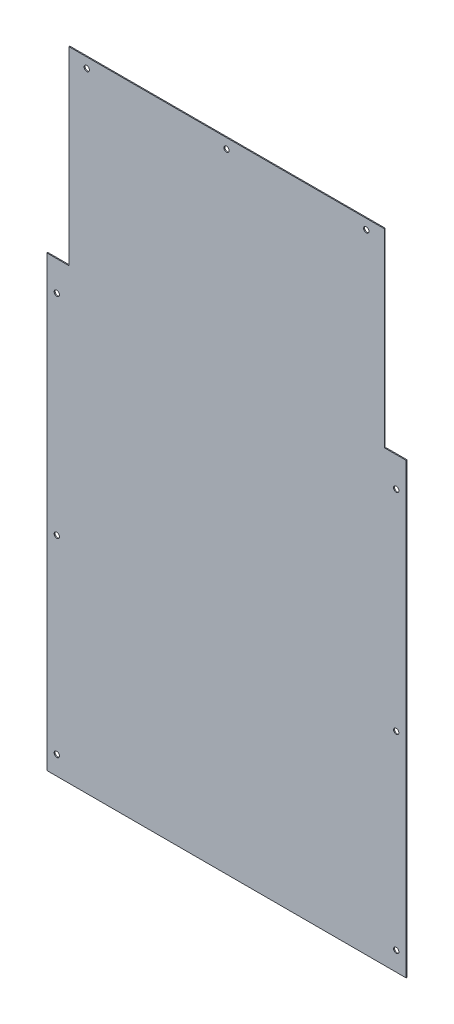
ISO-10303-21;
HEADER;
FILE_DESCRIPTION(('STEP AP214'),'2;1');
FILE_NAME('part.step','',(''),(''),'','','');
FILE_SCHEMA(('AUTOMOTIVE_DESIGN { 1 0 10303 214 1 1 1 1 }'));
ENDSEC;
DATA;
#1=APPLICATION_CONTEXT('core data for automotive mechanical design processes');
#2=APPLICATION_PROTOCOL_DEFINITION('international standard','automotive_design',2000,#1);
#3=PRODUCT_CONTEXT('',#1,'mechanical');
#4=PRODUCT('Part','Part','',(#3));
#5=PRODUCT_RELATED_PRODUCT_CATEGORY('part','',(#4));
#6=PRODUCT_DEFINITION_FORMATION('','',#4);
#7=PRODUCT_DEFINITION_CONTEXT('part definition',#1,'design');
#8=PRODUCT_DEFINITION('design','',#6,#7);
#9=PRODUCT_DEFINITION_SHAPE('','',#8);
#10=(LENGTH_UNIT() NAMED_UNIT(*) SI_UNIT(.MILLI.,.METRE.));
#11=(NAMED_UNIT(*) PLANE_ANGLE_UNIT() SI_UNIT($,.RADIAN.));
#12=(NAMED_UNIT(*) SI_UNIT($,.STERADIAN.) SOLID_ANGLE_UNIT());
#13=UNCERTAINTY_MEASURE_WITH_UNIT(LENGTH_MEASURE(1.E-05),#10,'distance_accuracy_value','');
#14=(GEOMETRIC_REPRESENTATION_CONTEXT(3) GLOBAL_UNCERTAINTY_ASSIGNED_CONTEXT((#13)) GLOBAL_UNIT_ASSIGNED_CONTEXT((#10,
#11,#12)) REPRESENTATION_CONTEXT('',''));
#15=CARTESIAN_POINT('',(0.,0.,0.));
#16=DIRECTION('',(0.,0.,1.));
#17=DIRECTION('',(1.,0.,0.));
#18=AXIS2_PLACEMENT_3D('',#15,#16,#17);
#19=CARTESIAN_POINT('',(457.2,0.,1.2192));
#20=DIRECTION('',(-1.,0.,0.));
#21=DIRECTION('',(0.,0.,1.));
#22=AXIS2_PLACEMENT_3D('',#19,#20,#21);
#23=PLANE('',#22);
#24=DIRECTION('',(0.,0.,1.));
#25=VECTOR('',#24,1.);
#26=CARTESIAN_POINT('',(457.2,570.23,0.));
#27=LINE('',#26,#25);
#28=CARTESIAN_POINT('',(457.2,570.23,0.));
#29=VERTEX_POINT('',#28);
#30=CARTESIAN_POINT('',(457.2,570.23,1.2192));
#31=VERTEX_POINT('',#30);
#32=EDGE_CURVE('E130',#29,#31,#27,.T.);
#33=ORIENTED_EDGE('',*,*,#32,.T.);
#34=DIRECTION('',(0.,1.,0.));
#35=VECTOR('',#34,1.);
#36=CARTESIAN_POINT('',(457.2,0.,1.2192));
#37=LINE('',#36,#35);
#38=CARTESIAN_POINT('',(457.2,0.,1.2192));
#39=VERTEX_POINT('',#38);
#40=EDGE_CURVE('E115',#39,#31,#37,.T.);
#41=ORIENTED_EDGE('',*,*,#40,.F.);
#42=DIRECTION('',(0.,0.,-1.));
#43=VECTOR('',#42,1.);
#44=CARTESIAN_POINT('',(457.2,0.,1.2192));
#45=LINE('',#44,#43);
#46=CARTESIAN_POINT('',(457.2,0.,0.));
#47=VERTEX_POINT('',#46);
#48=EDGE_CURVE('E72',#39,#47,#45,.T.);
#49=ORIENTED_EDGE('',*,*,#48,.T.);
#50=DIRECTION('',(0.,1.,0.));
#51=VECTOR('',#50,1.);
#52=CARTESIAN_POINT('',(457.2,0.,0.));
#53=LINE('',#52,#51);
#54=EDGE_CURVE('E108',#47,#29,#53,.T.);
#55=ORIENTED_EDGE('',*,*,#54,.T.);
#56=EDGE_LOOP('',(#33,#41,#49,#55));
#57=FACE_BOUND('',#56,.T.);
#58=ADVANCED_FACE('F64',(#57),#23,.F.);
#59=CARTESIAN_POINT('',(0.,0.,1.2192));
#60=DIRECTION('',(1.,0.,0.));
#61=DIRECTION('',(0.,0.,-1.));
#62=AXIS2_PLACEMENT_3D('',#59,#60,#61);
#63=PLANE('',#62);
#64=DIRECTION('',(0.,-1.,0.));
#65=VECTOR('',#64,1.);
#66=CARTESIAN_POINT('',(0.,0.,1.2192));
#67=LINE('',#66,#65);
#68=CARTESIAN_POINT('',(0.,570.23,1.2192));
#69=VERTEX_POINT('',#68);
#70=CARTESIAN_POINT('',(0.,0.,1.2192));
#71=VERTEX_POINT('',#70);
#72=EDGE_CURVE('E121',#69,#71,#67,.T.);
#73=ORIENTED_EDGE('',*,*,#72,.F.);
#74=DIRECTION('',(0.,0.,1.));
#75=VECTOR('',#74,1.);
#76=CARTESIAN_POINT('',(0.,570.23,0.));
#77=LINE('',#76,#75);
#78=CARTESIAN_POINT('',(0.,570.23,0.));
#79=VERTEX_POINT('',#78);
#80=EDGE_CURVE('E148',#79,#69,#77,.T.);
#81=ORIENTED_EDGE('',*,*,#80,.F.);
#82=DIRECTION('',(0.,-1.,0.));
#83=VECTOR('',#82,1.);
#84=CARTESIAN_POINT('',(0.,0.,0.));
#85=LINE('',#84,#83);
#86=CARTESIAN_POINT('',(0.,0.,0.));
#87=VERTEX_POINT('',#86);
#88=EDGE_CURVE('E109',#79,#87,#85,.T.);
#89=ORIENTED_EDGE('',*,*,#88,.T.);
#90=DIRECTION('',(0.,0.,-1.));
#91=VECTOR('',#90,1.);
#92=CARTESIAN_POINT('',(0.,0.,1.2192));
#93=LINE('',#92,#91);
#94=EDGE_CURVE('E12',#71,#87,#93,.T.);
#95=ORIENTED_EDGE('',*,*,#94,.F.);
#96=EDGE_LOOP('',(#73,#81,#89,#95));
#97=FACE_BOUND('',#96,.T.);
#98=ADVANCED_FACE('F66',(#97),#63,.F.);
#99=CARTESIAN_POINT('',(0.,0.,1.2192));
#100=DIRECTION('',(0.,1.,0.));
#101=DIRECTION('',(0.,0.,1.));
#102=AXIS2_PLACEMENT_3D('',#99,#100,#101);
#103=PLANE('',#102);
#104=DIRECTION('',(1.,0.,0.));
#105=VECTOR('',#104,1.);
#106=CARTESIAN_POINT('',(0.,0.,0.));
#107=LINE('',#106,#105);
#108=EDGE_CURVE('E100',#87,#47,#107,.T.);
#109=ORIENTED_EDGE('',*,*,#108,.T.);
#110=ORIENTED_EDGE('',*,*,#48,.F.);
#111=DIRECTION('',(1.,0.,0.));
#112=VECTOR('',#111,1.);
#113=CARTESIAN_POINT('',(0.,0.,1.2192));
#114=LINE('',#113,#112);
#115=EDGE_CURVE('E88',#71,#39,#114,.T.);
#116=ORIENTED_EDGE('',*,*,#115,.F.);
#117=ORIENTED_EDGE('',*,*,#94,.T.);
#118=EDGE_LOOP('',(#109,#110,#116,#117));
#119=FACE_BOUND('',#118,.T.);
#120=ADVANCED_FACE('F102',(#119),#103,.F.);
#121=CARTESIAN_POINT('',(0.,0.,1.2192));
#122=DIRECTION('',(0.,0.,-1.));
#123=DIRECTION('',(-1.,0.,0.));
#124=AXIS2_PLACEMENT_3D('',#121,#122,#123);
#125=PLANE('',#124);
#126=CARTESIAN_POINT('',(50.8,798.83,1.2192));
#127=DIRECTION('',(0.,0.,1.));
#128=DIRECTION('',(1.,0.,0.));
#129=AXIS2_PLACEMENT_3D('',#126,#127,#128);
#130=CIRCLE('',#129,3.37819999999998);
#131=CARTESIAN_POINT('',(54.1782,798.83,1.2192));
#132=VERTEX_POINT('',#131);
#133=EDGE_CURVE('E219',#132,#132,#130,.T.);
#134=ORIENTED_EDGE('',*,*,#133,.F.);
#135=EDGE_LOOP('',(#134));
#136=FACE_BOUND('',#135,.T.);
#137=CARTESIAN_POINT('',(228.6,798.83,1.2192));
#138=DIRECTION('',(0.,0.,1.));
#139=DIRECTION('',(1.,0.,0.));
#140=AXIS2_PLACEMENT_3D('',#137,#138,#139);
#141=CIRCLE('',#140,3.3782);
#142=CARTESIAN_POINT('',(231.9782,798.83,1.2192));
#143=VERTEX_POINT('',#142);
#144=EDGE_CURVE('E213',#143,#143,#141,.T.);
#145=ORIENTED_EDGE('',*,*,#144,.F.);
#146=EDGE_LOOP('',(#145));
#147=FACE_BOUND('',#146,.T.);
#148=CARTESIAN_POINT('',(406.4,798.83,1.2192));
#149=DIRECTION('',(0.,0.,1.));
#150=DIRECTION('',(1.,0.,0.));
#151=AXIS2_PLACEMENT_3D('',#148,#149,#150);
#152=CIRCLE('',#151,3.3782);
#153=CARTESIAN_POINT('',(409.7782,798.83,1.2192));
#154=VERTEX_POINT('',#153);
#155=EDGE_CURVE('E207',#154,#154,#152,.T.);
#156=ORIENTED_EDGE('',*,*,#155,.F.);
#157=EDGE_LOOP('',(#156));
#158=FACE_BOUND('',#157,.T.);
#159=CARTESIAN_POINT('',(12.7,532.13,1.2192));
#160=DIRECTION('',(0.,0.,1.));
#161=DIRECTION('',(1.,0.,0.));
#162=AXIS2_PLACEMENT_3D('',#159,#160,#161);
#163=CIRCLE('',#162,3.37819999999999);
#164=CARTESIAN_POINT('',(16.0782,532.13,1.2192));
#165=VERTEX_POINT('',#164);
#166=EDGE_CURVE('E201',#165,#165,#163,.T.);
#167=ORIENTED_EDGE('',*,*,#166,.F.);
#168=EDGE_LOOP('',(#167));
#169=FACE_BOUND('',#168,.T.);
#170=CARTESIAN_POINT('',(12.7000000000001,265.43,1.2192));
#171=DIRECTION('',(0.,0.,1.));
#172=DIRECTION('',(1.,0.,0.));
#173=AXIS2_PLACEMENT_3D('',#170,#171,#172);
#174=CIRCLE('',#173,3.37819999999999);
#175=CARTESIAN_POINT('',(16.0782,265.43,1.2192));
#176=VERTEX_POINT('',#175);
#177=EDGE_CURVE('E195',#176,#176,#174,.T.);
#178=ORIENTED_EDGE('',*,*,#177,.F.);
#179=EDGE_LOOP('',(#178));
#180=FACE_BOUND('',#179,.T.);
#181=CARTESIAN_POINT('',(12.7000000000001,24.13,1.2192));
#182=DIRECTION('',(0.,0.,1.));
#183=DIRECTION('',(1.,0.,0.));
#184=AXIS2_PLACEMENT_3D('',#181,#182,#183);
#185=CIRCLE('',#184,3.37819999999999);
#186=CARTESIAN_POINT('',(16.0782000000001,24.13,1.2192));
#187=VERTEX_POINT('',#186);
#188=EDGE_CURVE('E189',#187,#187,#185,.T.);
#189=ORIENTED_EDGE('',*,*,#188,.F.);
#190=EDGE_LOOP('',(#189));
#191=FACE_BOUND('',#190,.T.);
#192=CARTESIAN_POINT('',(444.5,24.13,1.2192));
#193=DIRECTION('',(0.,0.,1.));
#194=DIRECTION('',(1.,0.,0.));
#195=AXIS2_PLACEMENT_3D('',#192,#193,#194);
#196=CIRCLE('',#195,3.3782);
#197=CARTESIAN_POINT('',(447.8782,24.13,1.2192));
#198=VERTEX_POINT('',#197);
#199=EDGE_CURVE('E183',#198,#198,#196,.T.);
#200=ORIENTED_EDGE('',*,*,#199,.F.);
#201=EDGE_LOOP('',(#200));
#202=FACE_BOUND('',#201,.T.);
#203=CARTESIAN_POINT('',(444.5,265.43,1.2192));
#204=DIRECTION('',(0.,0.,1.));
#205=DIRECTION('',(1.,0.,0.));
#206=AXIS2_PLACEMENT_3D('',#203,#204,#205);
#207=CIRCLE('',#206,3.3782);
#208=CARTESIAN_POINT('',(447.8782,265.43,1.2192));
#209=VERTEX_POINT('',#208);
#210=EDGE_CURVE('E177',#209,#209,#207,.T.);
#211=ORIENTED_EDGE('',*,*,#210,.F.);
#212=EDGE_LOOP('',(#211));
#213=FACE_BOUND('',#212,.T.);
#214=CARTESIAN_POINT('',(444.5,532.13,1.2192));
#215=DIRECTION('',(0.,0.,1.));
#216=DIRECTION('',(1.,0.,0.));
#217=AXIS2_PLACEMENT_3D('',#214,#215,#216);
#218=CIRCLE('',#217,3.3782);
#219=CARTESIAN_POINT('',(447.8782,532.13,1.2192));
#220=VERTEX_POINT('',#219);
#221=EDGE_CURVE('E171',#220,#220,#218,.T.);
#222=ORIENTED_EDGE('',*,*,#221,.F.);
#223=EDGE_LOOP('',(#222));
#224=FACE_BOUND('',#223,.T.);
#225=DIRECTION('',(0.,-1.,0.));
#226=VECTOR('',#225,1.);
#227=CARTESIAN_POINT('',(27.9400000000001,0.,1.2192));
#228=LINE('',#227,#226);
#229=CARTESIAN_POINT('',(27.94,811.53,1.2192));
#230=VERTEX_POINT('',#229);
#231=CARTESIAN_POINT('',(27.94,570.23,1.2192));
#232=VERTEX_POINT('',#231);
#233=EDGE_CURVE('E132',#230,#232,#228,.T.);
#234=ORIENTED_EDGE('',*,*,#233,.T.);
#235=DIRECTION('',(1.,0.,0.));
#236=VECTOR('',#235,1.);
#237=CARTESIAN_POINT('',(0.,570.23,1.2192));
#238=LINE('',#237,#236);
#239=EDGE_CURVE('E154',#69,#232,#238,.T.);
#240=ORIENTED_EDGE('',*,*,#239,.F.);
#241=ORIENTED_EDGE('',*,*,#72,.T.);
#242=ORIENTED_EDGE('',*,*,#115,.T.);
#243=ORIENTED_EDGE('',*,*,#40,.T.);
#244=DIRECTION('',(-1.,0.,0.));
#245=VECTOR('',#244,1.);
#246=CARTESIAN_POINT('',(457.2,570.23,1.2192));
#247=LINE('',#246,#245);
#248=CARTESIAN_POINT('',(429.26,570.23,1.2192));
#249=VERTEX_POINT('',#248);
#250=EDGE_CURVE('E133',#31,#249,#247,.T.);
#251=ORIENTED_EDGE('',*,*,#250,.T.);
#252=DIRECTION('',(0.,-1.,0.));
#253=VECTOR('',#252,1.);
#254=CARTESIAN_POINT('',(429.26,811.53,1.2192));
#255=LINE('',#254,#253);
#256=CARTESIAN_POINT('',(429.26,811.53,1.2192));
#257=VERTEX_POINT('',#256);
#258=EDGE_CURVE('E137',#257,#249,#255,.T.);
#259=ORIENTED_EDGE('',*,*,#258,.F.);
#260=DIRECTION('',(1.,0.,0.));
#261=VECTOR('',#260,1.);
#262=CARTESIAN_POINT('',(0.,811.53,1.2192));
#263=LINE('',#262,#261);
#264=EDGE_CURVE('E158',#230,#257,#263,.T.);
#265=ORIENTED_EDGE('',*,*,#264,.F.);
#266=EDGE_LOOP('',(#234,#240,#241,#242,#243,#251,#259,#265));
#267=FACE_BOUND('',#266,.T.);
#268=ADVANCED_FACE('F225',(#136,#147,#158,#169,#180,#191,#202,#213,#224,#267),#125,.F.);
#269=CARTESIAN_POINT('',(0.,0.,0.));
#270=DIRECTION('',(0.,0.,-1.));
#271=DIRECTION('',(-1.,0.,0.));
#272=AXIS2_PLACEMENT_3D('',#269,#270,#271);
#273=PLANE('',#272);
#274=CARTESIAN_POINT('',(50.8,798.83,0.));
#275=DIRECTION('',(0.,0.,1.));
#276=DIRECTION('',(1.,0.,0.));
#277=AXIS2_PLACEMENT_3D('',#274,#275,#276);
#278=CIRCLE('',#277,3.3782);
#279=CARTESIAN_POINT('',(54.1782,798.83,0.));
#280=VERTEX_POINT('',#279);
#281=EDGE_CURVE('E216',#280,#280,#278,.T.);
#282=ORIENTED_EDGE('',*,*,#281,.T.);
#283=EDGE_LOOP('',(#282));
#284=FACE_BOUND('',#283,.T.);
#285=CARTESIAN_POINT('',(228.6,798.83,0.));
#286=DIRECTION('',(0.,0.,1.));
#287=DIRECTION('',(1.,0.,0.));
#288=AXIS2_PLACEMENT_3D('',#285,#286,#287);
#289=CIRCLE('',#288,3.3782);
#290=CARTESIAN_POINT('',(231.9782,798.83,0.));
#291=VERTEX_POINT('',#290);
#292=EDGE_CURVE('E210',#291,#291,#289,.T.);
#293=ORIENTED_EDGE('',*,*,#292,.T.);
#294=EDGE_LOOP('',(#293));
#295=FACE_BOUND('',#294,.T.);
#296=CARTESIAN_POINT('',(406.4,798.83,0.));
#297=DIRECTION('',(0.,0.,1.));
#298=DIRECTION('',(1.,0.,0.));
#299=AXIS2_PLACEMENT_3D('',#296,#297,#298);
#300=CIRCLE('',#299,3.3782);
#301=CARTESIAN_POINT('',(409.7782,798.83,0.));
#302=VERTEX_POINT('',#301);
#303=EDGE_CURVE('E204',#302,#302,#300,.T.);
#304=ORIENTED_EDGE('',*,*,#303,.T.);
#305=EDGE_LOOP('',(#304));
#306=FACE_BOUND('',#305,.T.);
#307=CARTESIAN_POINT('',(12.7,532.13,0.));
#308=DIRECTION('',(0.,0.,1.));
#309=DIRECTION('',(1.,0.,0.));
#310=AXIS2_PLACEMENT_3D('',#307,#308,#309);
#311=CIRCLE('',#310,3.3782);
#312=CARTESIAN_POINT('',(16.0782,532.13,0.));
#313=VERTEX_POINT('',#312);
#314=EDGE_CURVE('E198',#313,#313,#311,.T.);
#315=ORIENTED_EDGE('',*,*,#314,.T.);
#316=EDGE_LOOP('',(#315));
#317=FACE_BOUND('',#316,.T.);
#318=CARTESIAN_POINT('',(12.7000000000001,265.43,0.));
#319=DIRECTION('',(0.,0.,1.));
#320=DIRECTION('',(1.,0.,0.));
#321=AXIS2_PLACEMENT_3D('',#318,#319,#320);
#322=CIRCLE('',#321,3.3782);
#323=CARTESIAN_POINT('',(16.0782000000001,265.43,0.));
#324=VERTEX_POINT('',#323);
#325=EDGE_CURVE('E192',#324,#324,#322,.T.);
#326=ORIENTED_EDGE('',*,*,#325,.T.);
#327=EDGE_LOOP('',(#326));
#328=FACE_BOUND('',#327,.T.);
#329=CARTESIAN_POINT('',(12.7000000000001,24.13,0.));
#330=DIRECTION('',(0.,0.,1.));
#331=DIRECTION('',(1.,0.,0.));
#332=AXIS2_PLACEMENT_3D('',#329,#330,#331);
#333=CIRCLE('',#332,3.3782);
#334=CARTESIAN_POINT('',(16.0782000000001,24.13,0.));
#335=VERTEX_POINT('',#334);
#336=EDGE_CURVE('E186',#335,#335,#333,.T.);
#337=ORIENTED_EDGE('',*,*,#336,.T.);
#338=EDGE_LOOP('',(#337));
#339=FACE_BOUND('',#338,.T.);
#340=CARTESIAN_POINT('',(444.5,24.13,0.));
#341=DIRECTION('',(0.,0.,1.));
#342=DIRECTION('',(1.,0.,0.));
#343=AXIS2_PLACEMENT_3D('',#340,#341,#342);
#344=CIRCLE('',#343,3.3782);
#345=CARTESIAN_POINT('',(447.8782,24.13,0.));
#346=VERTEX_POINT('',#345);
#347=EDGE_CURVE('E180',#346,#346,#344,.T.);
#348=ORIENTED_EDGE('',*,*,#347,.T.);
#349=EDGE_LOOP('',(#348));
#350=FACE_BOUND('',#349,.T.);
#351=CARTESIAN_POINT('',(444.5,265.43,0.));
#352=DIRECTION('',(0.,0.,1.));
#353=DIRECTION('',(1.,0.,0.));
#354=AXIS2_PLACEMENT_3D('',#351,#352,#353);
#355=CIRCLE('',#354,3.3782);
#356=CARTESIAN_POINT('',(447.8782,265.43,0.));
#357=VERTEX_POINT('',#356);
#358=EDGE_CURVE('E174',#357,#357,#355,.T.);
#359=ORIENTED_EDGE('',*,*,#358,.T.);
#360=EDGE_LOOP('',(#359));
#361=FACE_BOUND('',#360,.T.);
#362=CARTESIAN_POINT('',(444.5,532.13,0.));
#363=DIRECTION('',(0.,0.,1.));
#364=DIRECTION('',(1.,0.,0.));
#365=AXIS2_PLACEMENT_3D('',#362,#363,#364);
#366=CIRCLE('',#365,3.3782);
#367=CARTESIAN_POINT('',(447.8782,532.13,0.));
#368=VERTEX_POINT('',#367);
#369=EDGE_CURVE('E139',#368,#368,#366,.T.);
#370=ORIENTED_EDGE('',*,*,#369,.T.);
#371=EDGE_LOOP('',(#370));
#372=FACE_BOUND('',#371,.T.);
#373=DIRECTION('',(1.,0.,0.));
#374=VECTOR('',#373,1.);
#375=CARTESIAN_POINT('',(0.,570.23,0.));
#376=LINE('',#375,#374);
#377=CARTESIAN_POINT('',(27.94,570.23,0.));
#378=VERTEX_POINT('',#377);
#379=EDGE_CURVE('E149',#79,#378,#376,.T.);
#380=ORIENTED_EDGE('',*,*,#379,.T.);
#381=DIRECTION('',(0.,-1.,0.));
#382=VECTOR('',#381,1.);
#383=CARTESIAN_POINT('',(27.9400000000001,0.,0.));
#384=LINE('',#383,#382);
#385=CARTESIAN_POINT('',(27.94,811.53,0.));
#386=VERTEX_POINT('',#385);
#387=EDGE_CURVE('E157',#386,#378,#384,.T.);
#388=ORIENTED_EDGE('',*,*,#387,.F.);
#389=DIRECTION('',(1.,0.,0.));
#390=VECTOR('',#389,1.);
#391=CARTESIAN_POINT('',(0.,811.53,0.));
#392=LINE('',#391,#390);
#393=CARTESIAN_POINT('',(429.26,811.53,0.));
#394=VERTEX_POINT('',#393);
#395=EDGE_CURVE('E164',#386,#394,#392,.T.);
#396=ORIENTED_EDGE('',*,*,#395,.T.);
#397=DIRECTION('',(0.,-1.,0.));
#398=VECTOR('',#397,1.);
#399=CARTESIAN_POINT('',(429.26,811.53,0.));
#400=LINE('',#399,#398);
#401=CARTESIAN_POINT('',(429.26,570.23,0.));
#402=VERTEX_POINT('',#401);
#403=EDGE_CURVE('E136',#394,#402,#400,.T.);
#404=ORIENTED_EDGE('',*,*,#403,.T.);
#405=DIRECTION('',(-1.,0.,0.));
#406=VECTOR('',#405,1.);
#407=CARTESIAN_POINT('',(457.2,570.23,0.));
#408=LINE('',#407,#406);
#409=EDGE_CURVE('E120',#29,#402,#408,.T.);
#410=ORIENTED_EDGE('',*,*,#409,.F.);
#411=ORIENTED_EDGE('',*,*,#54,.F.);
#412=ORIENTED_EDGE('',*,*,#108,.F.);
#413=ORIENTED_EDGE('',*,*,#88,.F.);
#414=EDGE_LOOP('',(#380,#388,#396,#404,#410,#411,#412,#413));
#415=FACE_BOUND('',#414,.T.);
#416=ADVANCED_FACE('F118',(#284,#295,#306,#317,#328,#339,#350,#361,#372,#415),#273,.T.);
#417=CARTESIAN_POINT('',(0.,570.23,0.));
#418=DIRECTION('',(0.,-1.,0.));
#419=DIRECTION('',(0.,0.,-1.));
#420=AXIS2_PLACEMENT_3D('',#417,#418,#419);
#421=PLANE('',#420);
#422=ORIENTED_EDGE('',*,*,#239,.T.);
#423=DIRECTION('',(0.,0.,1.));
#424=VECTOR('',#423,1.);
#425=CARTESIAN_POINT('',(27.94,570.23,0.));
#426=LINE('',#425,#424);
#427=EDGE_CURVE('E144',#378,#232,#426,.T.);
#428=ORIENTED_EDGE('',*,*,#427,.F.);
#429=ORIENTED_EDGE('',*,*,#379,.F.);
#430=ORIENTED_EDGE('',*,*,#80,.T.);
#431=EDGE_LOOP('',(#422,#428,#429,#430));
#432=FACE_BOUND('',#431,.T.);
#433=ADVANCED_FACE('F280',(#432),#421,.F.);
#434=CARTESIAN_POINT('',(0.,811.53,0.));
#435=DIRECTION('',(0.,-1.,0.));
#436=DIRECTION('',(0.,0.,-1.));
#437=AXIS2_PLACEMENT_3D('',#434,#435,#436);
#438=PLANE('',#437);
#439=DIRECTION('',(0.,0.,-1.));
#440=VECTOR('',#439,1.);
#441=CARTESIAN_POINT('',(429.26,811.53,0.));
#442=LINE('',#441,#440);
#443=EDGE_CURVE('E126',#257,#394,#442,.T.);
#444=ORIENTED_EDGE('',*,*,#443,.T.);
#445=ORIENTED_EDGE('',*,*,#395,.F.);
#446=DIRECTION('',(0.,0.,1.));
#447=VECTOR('',#446,1.);
#448=CARTESIAN_POINT('',(27.94,811.53,0.));
#449=LINE('',#448,#447);
#450=EDGE_CURVE('E145',#386,#230,#449,.T.);
#451=ORIENTED_EDGE('',*,*,#450,.T.);
#452=ORIENTED_EDGE('',*,*,#264,.T.);
#453=EDGE_LOOP('',(#444,#445,#451,#452));
#454=FACE_BOUND('',#453,.T.);
#455=ADVANCED_FACE('F278',(#454),#438,.F.);
#456=CARTESIAN_POINT('',(27.9400000000001,0.,0.));
#457=DIRECTION('',(-1.,0.,0.));
#458=DIRECTION('',(0.,-1.,0.));
#459=AXIS2_PLACEMENT_3D('',#456,#457,#458);
#460=PLANE('',#459);
#461=ORIENTED_EDGE('',*,*,#233,.F.);
#462=ORIENTED_EDGE('',*,*,#450,.F.);
#463=ORIENTED_EDGE('',*,*,#387,.T.);
#464=ORIENTED_EDGE('',*,*,#427,.T.);
#465=EDGE_LOOP('',(#461,#462,#463,#464));
#466=FACE_BOUND('',#465,.T.);
#467=ADVANCED_FACE('F256',(#466),#460,.T.);
#468=CARTESIAN_POINT('',(457.2,570.23,0.));
#469=DIRECTION('',(0.,1.,0.));
#470=DIRECTION('',(0.,0.,1.));
#471=AXIS2_PLACEMENT_3D('',#468,#469,#470);
#472=PLANE('',#471);
#473=ORIENTED_EDGE('',*,*,#250,.F.);
#474=ORIENTED_EDGE('',*,*,#32,.F.);
#475=ORIENTED_EDGE('',*,*,#409,.T.);
#476=DIRECTION('',(0.,0.,1.));
#477=VECTOR('',#476,1.);
#478=CARTESIAN_POINT('',(429.26,570.23,0.));
#479=LINE('',#478,#477);
#480=EDGE_CURVE('E79',#402,#249,#479,.T.);
#481=ORIENTED_EDGE('',*,*,#480,.T.);
#482=EDGE_LOOP('',(#473,#474,#475,#481));
#483=FACE_BOUND('',#482,.T.);
#484=ADVANCED_FACE('F276',(#483),#472,.T.);
#485=CARTESIAN_POINT('',(429.26,811.53,0.));
#486=DIRECTION('',(-1.,0.,0.));
#487=DIRECTION('',(0.,-1.,0.));
#488=AXIS2_PLACEMENT_3D('',#485,#486,#487);
#489=PLANE('',#488);
#490=ORIENTED_EDGE('',*,*,#258,.T.);
#491=ORIENTED_EDGE('',*,*,#480,.F.);
#492=ORIENTED_EDGE('',*,*,#403,.F.);
#493=ORIENTED_EDGE('',*,*,#443,.F.);
#494=EDGE_LOOP('',(#490,#491,#492,#493));
#495=FACE_BOUND('',#494,.T.);
#496=ADVANCED_FACE('F277',(#495),#489,.F.);
#497=CARTESIAN_POINT('',(444.5,532.13,1.2192));
#498=DIRECTION('',(0.,0.,1.));
#499=DIRECTION('',(1.,0.,0.));
#500=AXIS2_PLACEMENT_3D('',#497,#498,#499);
#501=CYLINDRICAL_SURFACE('',#500,3.3782);
#502=ORIENTED_EDGE('',*,*,#369,.F.);
#503=EDGE_LOOP('',(#502));
#504=FACE_BOUND('',#503,.T.);
#505=ORIENTED_EDGE('',*,*,#221,.T.);
#506=EDGE_LOOP('',(#505));
#507=FACE_BOUND('',#506,.T.);
#508=ADVANCED_FACE('F347',(#504,#507),#501,.F.);
#509=CARTESIAN_POINT('',(444.5,265.43,1.2192));
#510=DIRECTION('',(0.,0.,1.));
#511=DIRECTION('',(1.,0.,0.));
#512=AXIS2_PLACEMENT_3D('',#509,#510,#511);
#513=CYLINDRICAL_SURFACE('',#512,3.3782);
#514=ORIENTED_EDGE('',*,*,#358,.F.);
#515=EDGE_LOOP('',(#514));
#516=FACE_BOUND('',#515,.T.);
#517=ORIENTED_EDGE('',*,*,#210,.T.);
#518=EDGE_LOOP('',(#517));
#519=FACE_BOUND('',#518,.T.);
#520=ADVANCED_FACE('F356',(#516,#519),#513,.F.);
#521=CARTESIAN_POINT('',(444.5,24.13,1.2192));
#522=DIRECTION('',(0.,0.,1.));
#523=DIRECTION('',(1.,0.,0.));
#524=AXIS2_PLACEMENT_3D('',#521,#522,#523);
#525=CYLINDRICAL_SURFACE('',#524,3.3782);
#526=ORIENTED_EDGE('',*,*,#347,.F.);
#527=EDGE_LOOP('',(#526));
#528=FACE_BOUND('',#527,.T.);
#529=ORIENTED_EDGE('',*,*,#199,.T.);
#530=EDGE_LOOP('',(#529));
#531=FACE_BOUND('',#530,.T.);
#532=ADVANCED_FACE('F363',(#528,#531),#525,.F.);
#533=CARTESIAN_POINT('',(12.7000000000001,24.13,1.2192));
#534=DIRECTION('',(0.,0.,1.));
#535=DIRECTION('',(1.,0.,0.));
#536=AXIS2_PLACEMENT_3D('',#533,#534,#535);
#537=CYLINDRICAL_SURFACE('',#536,3.37819999999999);
#538=ORIENTED_EDGE('',*,*,#336,.F.);
#539=EDGE_LOOP('',(#538));
#540=FACE_BOUND('',#539,.T.);
#541=ORIENTED_EDGE('',*,*,#188,.T.);
#542=EDGE_LOOP('',(#541));
#543=FACE_BOUND('',#542,.T.);
#544=ADVANCED_FACE('F371',(#540,#543),#537,.F.);
#545=CARTESIAN_POINT('',(12.7000000000001,265.43,1.2192));
#546=DIRECTION('',(0.,0.,1.));
#547=DIRECTION('',(1.,0.,0.));
#548=AXIS2_PLACEMENT_3D('',#545,#546,#547);
#549=CYLINDRICAL_SURFACE('',#548,3.37819999999999);
#550=ORIENTED_EDGE('',*,*,#325,.F.);
#551=EDGE_LOOP('',(#550));
#552=FACE_BOUND('',#551,.T.);
#553=ORIENTED_EDGE('',*,*,#177,.T.);
#554=EDGE_LOOP('',(#553));
#555=FACE_BOUND('',#554,.T.);
#556=ADVANCED_FACE('F379',(#552,#555),#549,.F.);
#557=CARTESIAN_POINT('',(12.7,532.13,1.2192));
#558=DIRECTION('',(0.,0.,1.));
#559=DIRECTION('',(1.,0.,0.));
#560=AXIS2_PLACEMENT_3D('',#557,#558,#559);
#561=CYLINDRICAL_SURFACE('',#560,3.37819999999999);
#562=ORIENTED_EDGE('',*,*,#314,.F.);
#563=EDGE_LOOP('',(#562));
#564=FACE_BOUND('',#563,.T.);
#565=ORIENTED_EDGE('',*,*,#166,.T.);
#566=EDGE_LOOP('',(#565));
#567=FACE_BOUND('',#566,.T.);
#568=ADVANCED_FACE('F387',(#564,#567),#561,.F.);
#569=CARTESIAN_POINT('',(406.4,798.83,1.2192));
#570=DIRECTION('',(0.,0.,1.));
#571=DIRECTION('',(1.,0.,0.));
#572=AXIS2_PLACEMENT_3D('',#569,#570,#571);
#573=CYLINDRICAL_SURFACE('',#572,3.3782);
#574=ORIENTED_EDGE('',*,*,#303,.F.);
#575=EDGE_LOOP('',(#574));
#576=FACE_BOUND('',#575,.T.);
#577=ORIENTED_EDGE('',*,*,#155,.T.);
#578=EDGE_LOOP('',(#577));
#579=FACE_BOUND('',#578,.T.);
#580=ADVANCED_FACE('F395',(#576,#579),#573,.F.);
#581=CARTESIAN_POINT('',(228.6,798.83,1.2192));
#582=DIRECTION('',(0.,0.,1.));
#583=DIRECTION('',(1.,0.,0.));
#584=AXIS2_PLACEMENT_3D('',#581,#582,#583);
#585=CYLINDRICAL_SURFACE('',#584,3.3782);
#586=ORIENTED_EDGE('',*,*,#292,.F.);
#587=EDGE_LOOP('',(#586));
#588=FACE_BOUND('',#587,.T.);
#589=ORIENTED_EDGE('',*,*,#144,.T.);
#590=EDGE_LOOP('',(#589));
#591=FACE_BOUND('',#590,.T.);
#592=ADVANCED_FACE('F403',(#588,#591),#585,.F.);
#593=CARTESIAN_POINT('',(50.8,798.83,1.2192));
#594=DIRECTION('',(0.,0.,1.));
#595=DIRECTION('',(1.,0.,0.));
#596=AXIS2_PLACEMENT_3D('',#593,#594,#595);
#597=CYLINDRICAL_SURFACE('',#596,3.37819999999999);
#598=ORIENTED_EDGE('',*,*,#281,.F.);
#599=EDGE_LOOP('',(#598));
#600=FACE_BOUND('',#599,.T.);
#601=ORIENTED_EDGE('',*,*,#133,.T.);
#602=EDGE_LOOP('',(#601));
#603=FACE_BOUND('',#602,.T.);
#604=ADVANCED_FACE('F223',(#600,#603),#597,.F.);
#605=CLOSED_SHELL('',(#58,#98,#120,#268,#416,#433,#455,#467,#484,#496,#508,#520,#532,#544,#556,
#568,#580,#592,#604));
#606=MANIFOLD_SOLID_BREP('B2',#605);
#607=ADVANCED_BREP_SHAPE_REPRESENTATION('',(#18,#606),#14);
#608=SHAPE_DEFINITION_REPRESENTATION(#9,#607);
ENDSEC;
END-ISO-10303-21;
